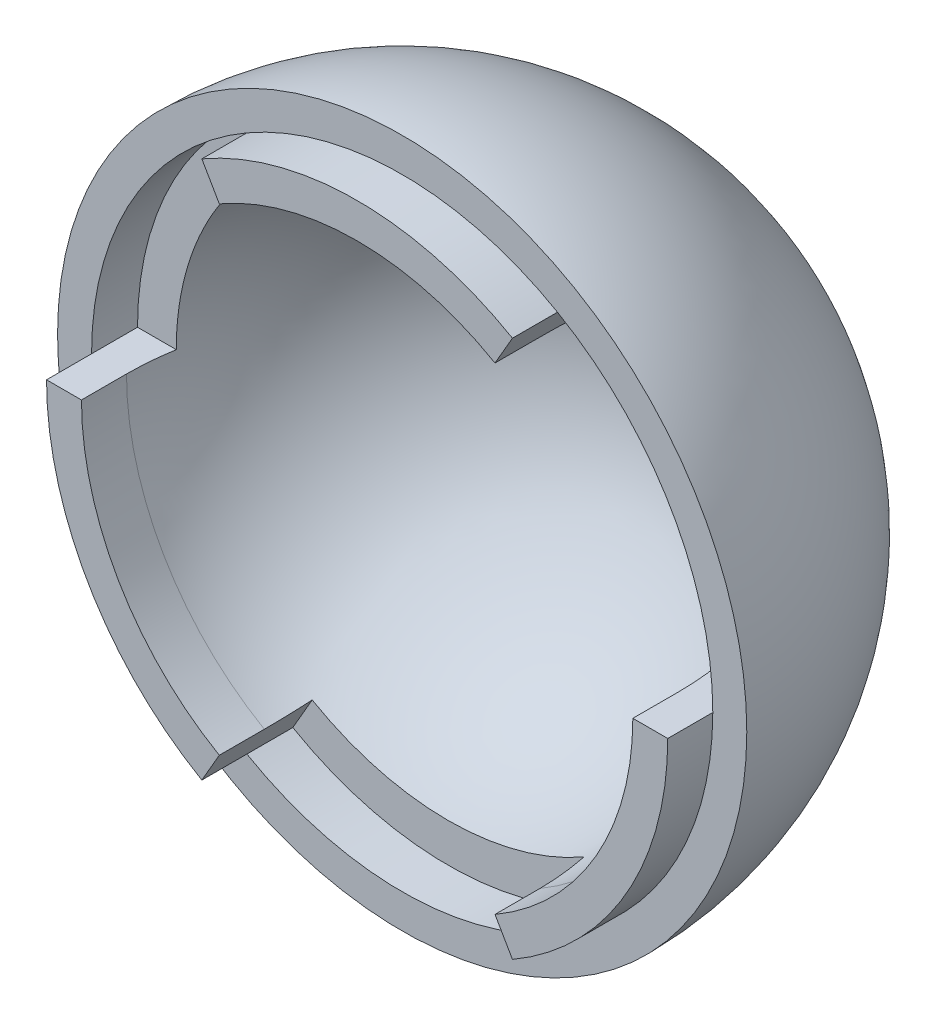
ISO-10303-21;
HEADER;
FILE_DESCRIPTION(('STEP AP214'),'2;1');
FILE_NAME('part.step','',(''),(''),'','','');
FILE_SCHEMA(('AUTOMOTIVE_DESIGN { 1 0 10303 214 1 1 1 1 }'));
ENDSEC;
DATA;
#1=APPLICATION_CONTEXT('core data for automotive mechanical design processes');
#2=APPLICATION_PROTOCOL_DEFINITION('international standard','automotive_design',2000,#1);
#3=PRODUCT_CONTEXT('',#1,'mechanical');
#4=PRODUCT('Part','Part','',(#3));
#5=PRODUCT_RELATED_PRODUCT_CATEGORY('part','',(#4));
#6=PRODUCT_DEFINITION_FORMATION('','',#4);
#7=PRODUCT_DEFINITION_CONTEXT('part definition',#1,'design');
#8=PRODUCT_DEFINITION('design','',#6,#7);
#9=PRODUCT_DEFINITION_SHAPE('','',#8);
#10=(LENGTH_UNIT() NAMED_UNIT(*) SI_UNIT(.MILLI.,.METRE.));
#11=(NAMED_UNIT(*) PLANE_ANGLE_UNIT() SI_UNIT($,.RADIAN.));
#12=(NAMED_UNIT(*) SI_UNIT($,.STERADIAN.) SOLID_ANGLE_UNIT());
#13=UNCERTAINTY_MEASURE_WITH_UNIT(LENGTH_MEASURE(1.E-05),#10,'distance_accuracy_value','');
#14=(GEOMETRIC_REPRESENTATION_CONTEXT(3) GLOBAL_UNCERTAINTY_ASSIGNED_CONTEXT((#13)) GLOBAL_UNIT_ASSIGNED_CONTEXT((#10,
#11,#12)) REPRESENTATION_CONTEXT('',''));
#15=CARTESIAN_POINT('',(0.,0.,0.));
#16=DIRECTION('',(0.,0.,1.));
#17=DIRECTION('',(1.,0.,0.));
#18=AXIS2_PLACEMENT_3D('',#15,#16,#17);
#19=CARTESIAN_POINT('',(0.,0.,0.));
#20=DIRECTION('',(0.,0.,-1.));
#21=DIRECTION('',(1.,0.,0.));
#22=AXIS2_PLACEMENT_3D('',#19,#20,#21);
#23=PLANE('',#22);
#24=CARTESIAN_POINT('',(0.,0.,0.));
#25=DIRECTION('',(0.,0.,-1.));
#26=DIRECTION('',(1.,0.,0.));
#27=AXIS2_PLACEMENT_3D('',#24,#25,#26);
#28=CIRCLE('',#27,75.);
#29=CARTESIAN_POINT('',(75.,0.,0.));
#30=VERTEX_POINT('',#29);
#31=EDGE_CURVE('E293',#30,#30,#28,.T.);
#32=ORIENTED_EDGE('',*,*,#31,.F.);
#33=EDGE_LOOP('',(#32));
#34=FACE_BOUND('',#33,.T.);
#35=CARTESIAN_POINT('',(0.,0.,0.));
#36=DIRECTION('',(0.,0.,1.));
#37=DIRECTION('',(-0.499999999999992,-0.866025403784443,0.));
#38=AXIS2_PLACEMENT_3D('',#35,#36,#37);
#39=CIRCLE('',#38,67.6);
#40=CARTESIAN_POINT('',(33.8,-58.543317295828,0.));
#41=VERTEX_POINT('',#40);
#42=CARTESIAN_POINT('',(67.6,9.40220123979429E-13,0.));
#43=VERTEX_POINT('',#42);
#44=EDGE_CURVE('E179',#41,#43,#39,.T.);
#45=ORIENTED_EDGE('',*,*,#44,.F.);
#46=CARTESIAN_POINT('',(0.,0.,0.));
#47=DIRECTION('',(0.,0.,1.));
#48=DIRECTION('',(-0.499999999999992,-0.866025403784443,0.));
#49=AXIS2_PLACEMENT_3D('',#46,#47,#48);
#50=CIRCLE('',#49,67.6);
#51=CARTESIAN_POINT('',(-33.7999999999995,-58.5433172958284,4.08805799704714E-13));
#52=VERTEX_POINT('',#51);
#53=EDGE_CURVE('E233',#52,#41,#50,.T.);
#54=ORIENTED_EDGE('',*,*,#53,.F.);
#55=CARTESIAN_POINT('',(0.,0.,0.));
#56=DIRECTION('',(0.,0.,1.));
#57=DIRECTION('',(-0.500000000000004,0.866025403784436,0.));
#58=AXIS2_PLACEMENT_3D('',#55,#56,#57);
#59=CIRCLE('',#58,67.6);
#60=CARTESIAN_POINT('',(-67.6000000000001,2.67147415300424E-13,0.));
#61=VERTEX_POINT('',#60);
#62=EDGE_CURVE('E48',#61,#52,#59,.T.);
#63=ORIENTED_EDGE('',*,*,#62,.F.);
#64=CARTESIAN_POINT('',(0.,0.,0.));
#65=DIRECTION('',(0.,0.,1.));
#66=DIRECTION('',(-0.500000000000004,0.866025403784436,0.));
#67=AXIS2_PLACEMENT_3D('',#64,#65,#66);
#68=CIRCLE('',#67,67.6);
#69=CARTESIAN_POINT('',(-33.8000000000003,58.5433172958279,-4.08805799704711E-13));
#70=VERTEX_POINT('',#69);
#71=EDGE_CURVE('E254',#70,#61,#68,.T.);
#72=ORIENTED_EDGE('',*,*,#71,.F.);
#73=CARTESIAN_POINT('',(0.,0.,0.));
#74=DIRECTION('',(0.,0.,1.));
#75=DIRECTION('',(1.,0.,0.));
#76=AXIS2_PLACEMENT_3D('',#73,#74,#75);
#77=CIRCLE('',#76,67.6);
#78=CARTESIAN_POINT('',(33.8000000000005,58.5433172958278,-4.0880579970471E-13));
#79=VERTEX_POINT('',#78);
#80=EDGE_CURVE('E54',#79,#70,#77,.T.);
#81=ORIENTED_EDGE('',*,*,#80,.F.);
#82=CARTESIAN_POINT('',(0.,0.,0.));
#83=DIRECTION('',(0.,0.,1.));
#84=DIRECTION('',(1.,0.,0.));
#85=AXIS2_PLACEMENT_3D('',#82,#83,#84);
#86=CIRCLE('',#85,67.6);
#87=EDGE_CURVE('E274',#43,#79,#86,.T.);
#88=ORIENTED_EDGE('',*,*,#87,.F.);
#89=EDGE_LOOP('',(#45,#54,#63,#72,#81,#88));
#90=FACE_BOUND('',#89,.T.);
#91=ADVANCED_FACE('F33',(#34,#90),#23,.F.);
#92=CARTESIAN_POINT('',(0.,0.,0.));
#93=DIRECTION('',(1.,0.,0.));
#94=DIRECTION('',(0.,1.,0.));
#95=AXIS2_PLACEMENT_3D('',#92,#93,#94);
#96=SPHERICAL_SURFACE('',#95,75.);
#97=CARTESIAN_POINT('',(0.,0.,0.));
#98=DIRECTION('',(0.,0.,-1.));
#99=DIRECTION('',(1.,0.,0.));
#100=AXIS2_PLACEMENT_3D('',#97,#98,#99);
#101=SPHERICAL_SURFACE('',#100,75.);
#102=ORIENTED_EDGE('',*,*,#31,.T.);
#103=EDGE_LOOP('',(#102));
#104=FACE_BOUND('',#103,.T.);
#105=ADVANCED_FACE('F365',(#104),#101,.T.);
#106=CARTESIAN_POINT('',(0.,0.,0.));
#107=DIRECTION('',(1.,0.,0.));
#108=DIRECTION('',(0.,-1.,0.));
#109=AXIS2_PLACEMENT_3D('',#106,#107,#108);
#110=SPHERICAL_SURFACE('',#109,60.);
#111=CARTESIAN_POINT('',(0.,0.,0.));
#112=DIRECTION('',(-0.866025403784443,0.499999999999992,0.));
#113=DIRECTION('',(-0.499999999999992,-0.866025403784443,0.));
#114=AXIS2_PLACEMENT_3D('',#111,#112,#113);
#115=CIRCLE('',#114,60.);
#116=CARTESIAN_POINT('',(-29.5803989154975,-51.2347538297984,-9.99999999999964));
#117=VERTEX_POINT('',#116);
#118=CARTESIAN_POINT('',(-29.9999999999995,-51.9615242270666,0.));
#119=VERTEX_POINT('',#118);
#120=EDGE_CURVE('E251',#117,#119,#115,.T.);
#121=ORIENTED_EDGE('',*,*,#120,.F.);
#122=CARTESIAN_POINT('',(0.,0.,-10.));
#123=DIRECTION('',(0.,0.,1.));
#124=DIRECTION('',(0.,-1.,0.));
#125=AXIS2_PLACEMENT_3D('',#122,#123,#124);
#126=CIRCLE('',#125,59.1607978309962);
#127=CARTESIAN_POINT('',(29.5803989154982,-51.2347538297981,-9.99999999999929));
#128=VERTEX_POINT('',#127);
#129=EDGE_CURVE('E11',#117,#128,#126,.T.);
#130=ORIENTED_EDGE('',*,*,#129,.T.);
#131=CARTESIAN_POINT('',(0.,0.,0.));
#132=DIRECTION('',(0.866025403784439,0.5,0.));
#133=DIRECTION('',(-0.5,0.866025403784439,0.));
#134=AXIS2_PLACEMENT_3D('',#131,#132,#133);
#135=CIRCLE('',#134,60.);
#136=CARTESIAN_POINT('',(30.,-51.9615242270663,7.25690768706588E-13));
#137=VERTEX_POINT('',#136);
#138=EDGE_CURVE('E247',#137,#128,#135,.T.);
#139=ORIENTED_EDGE('',*,*,#138,.F.);
#140=CARTESIAN_POINT('',(0.,0.,0.));
#141=DIRECTION('',(0.,0.,1.));
#142=DIRECTION('',(1.,0.,0.));
#143=AXIS2_PLACEMENT_3D('',#140,#141,#142);
#144=CIRCLE('',#143,60.);
#145=CARTESIAN_POINT('',(60.,8.36136715420821E-13,0.));
#146=VERTEX_POINT('',#145);
#147=EDGE_CURVE('E296',#137,#146,#144,.T.);
#148=ORIENTED_EDGE('',*,*,#147,.T.);
#149=CARTESIAN_POINT('',(0.,0.,0.));
#150=DIRECTION('',(0.,-1.,0.));
#151=DIRECTION('',(0.,0.,-1.));
#152=AXIS2_PLACEMENT_3D('',#149,#150,#151);
#153=CIRCLE('',#152,60.);
#154=CARTESIAN_POINT('',(59.1607978309962,0.,-10.));
#155=VERTEX_POINT('',#154);
#156=EDGE_CURVE('E291',#155,#146,#153,.T.);
#157=ORIENTED_EDGE('',*,*,#156,.F.);
#158=CARTESIAN_POINT('',(0.,0.,-10.));
#159=DIRECTION('',(0.,0.,1.));
#160=DIRECTION('',(1.,0.,0.));
#161=AXIS2_PLACEMENT_3D('',#158,#159,#160);
#162=CIRCLE('',#161,59.1607978309962);
#163=CARTESIAN_POINT('',(29.5803989154985,51.2347538297977,-10.));
#164=VERTEX_POINT('',#163);
#165=EDGE_CURVE('E299',#155,#164,#162,.T.);
#166=ORIENTED_EDGE('',*,*,#165,.T.);
#167=CARTESIAN_POINT('',(0.,0.,0.));
#168=DIRECTION('',(-0.866025403784434,0.500000000000008,0.));
#169=DIRECTION('',(-0.500000000000008,-0.866025403784434,0.));
#170=AXIS2_PLACEMENT_3D('',#167,#168,#169);
#171=CIRCLE('',#170,60.);
#172=CARTESIAN_POINT('',(30.0000000000004,51.9615242270661,0.));
#173=VERTEX_POINT('',#172);
#174=EDGE_CURVE('E287',#173,#164,#171,.T.);
#175=ORIENTED_EDGE('',*,*,#174,.F.);
#176=CARTESIAN_POINT('',(-30.0000000000002,51.9615242270662,0.));
#177=VERTEX_POINT('',#176);
#178=EDGE_CURVE('E297',#173,#177,#144,.T.);
#179=ORIENTED_EDGE('',*,*,#178,.T.);
#180=CARTESIAN_POINT('',(0.,0.,0.));
#181=DIRECTION('',(0.866025403784436,0.500000000000004,0.));
#182=DIRECTION('',(-0.500000000000004,0.866025403784436,0.));
#183=AXIS2_PLACEMENT_3D('',#180,#181,#182);
#184=CIRCLE('',#183,60.);
#185=CARTESIAN_POINT('',(-29.5803989154984,51.2347538297978,-10.0000000000004));
#186=VERTEX_POINT('',#185);
#187=EDGE_CURVE('E271',#186,#177,#184,.T.);
#188=ORIENTED_EDGE('',*,*,#187,.F.);
#189=CARTESIAN_POINT('',(0.,0.,-10.));
#190=DIRECTION('',(0.,0.,1.));
#191=DIRECTION('',(0.,-1.,0.));
#192=AXIS2_PLACEMENT_3D('',#189,#190,#191);
#193=CIRCLE('',#192,59.1607978309962);
#194=CARTESIAN_POINT('',(-59.1607978309962,1.2539385873303E-13,-9.99999999999964));
#195=VERTEX_POINT('',#194);
#196=EDGE_CURVE('E41',#186,#195,#193,.T.);
#197=ORIENTED_EDGE('',*,*,#196,.T.);
#198=CARTESIAN_POINT('',(0.,0.,0.));
#199=DIRECTION('',(0.,-1.,0.));
#200=DIRECTION('',(0.,0.,-1.));
#201=AXIS2_PLACEMENT_3D('',#198,#199,#200);
#202=CIRCLE('',#201,60.);
#203=CARTESIAN_POINT('',(-60.,2.33818520101181E-13,3.62845384353291E-13));
#204=VERTEX_POINT('',#203);
#205=EDGE_CURVE('E267',#204,#195,#202,.T.);
#206=ORIENTED_EDGE('',*,*,#205,.F.);
#207=EDGE_CURVE('E300',#204,#119,#144,.T.);
#208=ORIENTED_EDGE('',*,*,#207,.T.);
#209=EDGE_LOOP('',(#121,#130,#139,#148,#157,#166,#175,#179,#188,#197,#206,#208));
#210=FACE_BOUND('',#209,.T.);
#211=ADVANCED_FACE('F35',(#210),#110,.F.);
#212=CARTESIAN_POINT('',(0.,0.,-10.));
#213=DIRECTION('',(0.,0.,1.));
#214=DIRECTION('',(1.,0.,0.));
#215=AXIS2_PLACEMENT_3D('',#212,#213,#214);
#216=CYLINDRICAL_SURFACE('',#215,67.6);
#217=ORIENTED_EDGE('',*,*,#87,.T.);
#218=DIRECTION('',(0.,0.,1.));
#219=VECTOR('',#218,1.);
#220=CARTESIAN_POINT('',(33.8000000000005,58.5433172958278,-10.));
#221=LINE('',#220,#219);
#222=CARTESIAN_POINT('',(33.8000000000005,58.5433172958278,-10.));
#223=VERTEX_POINT('',#222);
#224=EDGE_CURVE('E283',#223,#79,#221,.T.);
#225=ORIENTED_EDGE('',*,*,#224,.F.);
#226=CARTESIAN_POINT('',(0.,0.,-10.));
#227=DIRECTION('',(0.,0.,1.));
#228=DIRECTION('',(1.,0.,0.));
#229=AXIS2_PLACEMENT_3D('',#226,#227,#228);
#230=CIRCLE('',#229,67.6);
#231=CARTESIAN_POINT('',(67.6,0.,-10.));
#232=VERTEX_POINT('',#231);
#233=EDGE_CURVE('E275',#232,#223,#230,.T.);
#234=ORIENTED_EDGE('',*,*,#233,.F.);
#235=DIRECTION('',(0.,0.,1.));
#236=VECTOR('',#235,1.);
#237=CARTESIAN_POINT('',(67.6,0.,-10.));
#238=LINE('',#237,#236);
#239=EDGE_CURVE('E285',#232,#43,#238,.T.);
#240=ORIENTED_EDGE('',*,*,#239,.T.);
#241=EDGE_LOOP('',(#217,#225,#234,#240));
#242=FACE_BOUND('',#241,.T.);
#243=ADVANCED_FACE('F374',(#242),#216,.F.);
#244=CARTESIAN_POINT('',(59.,0.,-10.));
#245=DIRECTION('',(0.,-1.,0.));
#246=DIRECTION('',(0.,0.,-1.));
#247=AXIS2_PLACEMENT_3D('',#244,#245,#246);
#248=PLANE('',#247);
#249=ORIENTED_EDGE('',*,*,#156,.T.);
#250=DIRECTION('',(0.,0.,-1.));
#251=VECTOR('',#250,1.);
#252=CARTESIAN_POINT('',(60.,8.36136715420821E-13,9.8));
#253=LINE('',#252,#251);
#254=CARTESIAN_POINT('',(60.,8.36136715420821E-13,9.8));
#255=VERTEX_POINT('',#254);
#256=EDGE_CURVE('E167',#255,#146,#253,.T.);
#257=ORIENTED_EDGE('',*,*,#256,.F.);
#258=DIRECTION('',(-1.,0.,0.));
#259=VECTOR('',#258,1.);
#260=CARTESIAN_POINT('',(67.6,9.40220123979429E-13,9.8));
#261=LINE('',#260,#259);
#262=CARTESIAN_POINT('',(67.6,9.40220123979429E-13,9.8));
#263=VERTEX_POINT('',#262);
#264=EDGE_CURVE('E159',#263,#255,#261,.T.);
#265=ORIENTED_EDGE('',*,*,#264,.F.);
#266=DIRECTION('',(0.,0.,-1.));
#267=VECTOR('',#266,1.);
#268=CARTESIAN_POINT('',(67.6,9.40220123979429E-13,9.8));
#269=LINE('',#268,#267);
#270=EDGE_CURVE('E165',#263,#43,#269,.T.);
#271=ORIENTED_EDGE('',*,*,#270,.T.);
#272=ORIENTED_EDGE('',*,*,#239,.F.);
#273=DIRECTION('',(1.,0.,0.));
#274=VECTOR('',#273,1.);
#275=CARTESIAN_POINT('',(59.,0.,-10.));
#276=LINE('',#275,#274);
#277=EDGE_CURVE('E281',#155,#232,#276,.T.);
#278=ORIENTED_EDGE('',*,*,#277,.F.);
#279=EDGE_LOOP('',(#249,#257,#265,#271,#272,#278));
#280=FACE_BOUND('',#279,.T.);
#281=ADVANCED_FACE('F162',(#280),#248,.F.);
#282=CARTESIAN_POINT('',(33.8000000000005,58.5433172958278,-10.));
#283=DIRECTION('',(-0.866025403784434,0.500000000000008,0.));
#284=DIRECTION('',(-0.500000000000008,-0.866025403784434,0.));
#285=AXIS2_PLACEMENT_3D('',#282,#283,#284);
#286=PLANE('',#285);
#287=ORIENTED_EDGE('',*,*,#174,.T.);
#288=DIRECTION('',(-0.500000000000008,-0.866025403784434,0.));
#289=VECTOR('',#288,1.);
#290=CARTESIAN_POINT('',(33.8000000000005,58.5433172958278,-10.));
#291=LINE('',#290,#289);
#292=EDGE_CURVE('E278',#223,#164,#291,.T.);
#293=ORIENTED_EDGE('',*,*,#292,.F.);
#294=ORIENTED_EDGE('',*,*,#224,.T.);
#295=DIRECTION('',(0.,0.,-1.));
#296=VECTOR('',#295,1.);
#297=CARTESIAN_POINT('',(33.8000000000005,58.5433172958278,9.8));
#298=LINE('',#297,#296);
#299=CARTESIAN_POINT('',(33.8000000000005,58.5433172958278,9.8));
#300=VERTEX_POINT('',#299);
#301=EDGE_CURVE('E220',#300,#79,#298,.T.);
#302=ORIENTED_EDGE('',*,*,#301,.F.);
#303=DIRECTION('',(0.500000000000011,0.866025403784432,0.));
#304=VECTOR('',#303,1.);
#305=CARTESIAN_POINT('',(30.0000000000004,51.9615242270661,9.8));
#306=LINE('',#305,#304);
#307=CARTESIAN_POINT('',(30.0000000000004,51.9615242270661,9.8));
#308=VERTEX_POINT('',#307);
#309=EDGE_CURVE('E218',#308,#300,#306,.T.);
#310=ORIENTED_EDGE('',*,*,#309,.F.);
#311=DIRECTION('',(0.,0.,-1.));
#312=VECTOR('',#311,1.);
#313=CARTESIAN_POINT('',(30.0000000000004,51.9615242270661,9.8));
#314=LINE('',#313,#312);
#315=EDGE_CURVE('E224',#308,#173,#314,.T.);
#316=ORIENTED_EDGE('',*,*,#315,.T.);
#317=EDGE_LOOP('',(#287,#293,#294,#302,#310,#316));
#318=FACE_BOUND('',#317,.T.);
#319=ADVANCED_FACE('F346',(#318),#286,.F.);
#320=CARTESIAN_POINT('',(0.,0.,-10.));
#321=DIRECTION('',(0.,0.,1.));
#322=DIRECTION('',(1.,0.,0.));
#323=AXIS2_PLACEMENT_3D('',#320,#321,#322);
#324=PLANE('',#323);
#325=ORIENTED_EDGE('',*,*,#277,.T.);
#326=ORIENTED_EDGE('',*,*,#233,.T.);
#327=ORIENTED_EDGE('',*,*,#292,.T.);
#328=ORIENTED_EDGE('',*,*,#165,.F.);
#329=EDGE_LOOP('',(#325,#326,#327,#328));
#330=FACE_BOUND('',#329,.T.);
#331=ADVANCED_FACE('F337',(#330),#324,.T.);
#332=CARTESIAN_POINT('',(0.,-1.04744440165294E-13,-10.));
#333=DIRECTION('',(0.,0.,1.));
#334=DIRECTION('',(0.,-1.,0.));
#335=AXIS2_PLACEMENT_3D('',#332,#333,#334);
#336=CYLINDRICAL_SURFACE('',#335,67.6);
#337=ORIENTED_EDGE('',*,*,#71,.T.);
#338=DIRECTION('',(0.,0.,1.));
#339=VECTOR('',#338,1.);
#340=CARTESIAN_POINT('',(-67.6000000000001,1.62402975135134E-13,-9.99999999999959));
#341=LINE('',#340,#339);
#342=CARTESIAN_POINT('',(-67.6000000000001,1.62402975135134E-13,-9.99999999999959));
#343=VERTEX_POINT('',#342);
#344=EDGE_CURVE('E263',#343,#61,#341,.T.);
#345=ORIENTED_EDGE('',*,*,#344,.F.);
#346=CARTESIAN_POINT('',(0.,-1.04744440165294E-13,-10.));
#347=DIRECTION('',(0.,0.,1.));
#348=DIRECTION('',(-0.500000000000004,0.866025403784436,0.));
#349=AXIS2_PLACEMENT_3D('',#346,#347,#348);
#350=CIRCLE('',#349,67.6);
#351=CARTESIAN_POINT('',(-33.8000000000003,58.5433172958278,-10.0000000000004));
#352=VERTEX_POINT('',#351);
#353=EDGE_CURVE('E255',#352,#343,#350,.T.);
#354=ORIENTED_EDGE('',*,*,#353,.F.);
#355=DIRECTION('',(0.,0.,1.));
#356=VECTOR('',#355,1.);
#357=CARTESIAN_POINT('',(-33.8000000000003,58.5433172958278,-10.0000000000004));
#358=LINE('',#357,#356);
#359=EDGE_CURVE('E265',#352,#70,#358,.T.);
#360=ORIENTED_EDGE('',*,*,#359,.T.);
#361=EDGE_LOOP('',(#337,#345,#354,#360));
#362=FACE_BOUND('',#361,.T.);
#363=ADVANCED_FACE('F318',(#362),#336,.F.);
#364=CARTESIAN_POINT('',(-29.5000000000003,51.0954988232816,-10.0000000000004));
#365=DIRECTION('',(0.866025403784436,0.500000000000004,0.));
#366=DIRECTION('',(-0.500000000000004,0.866025403784436,0.));
#367=AXIS2_PLACEMENT_3D('',#364,#365,#366);
#368=PLANE('',#367);
#369=ORIENTED_EDGE('',*,*,#187,.T.);
#370=DIRECTION('',(0.,0.,-1.));
#371=VECTOR('',#370,1.);
#372=CARTESIAN_POINT('',(-30.0000000000002,51.9615242270662,9.8));
#373=LINE('',#372,#371);
#374=CARTESIAN_POINT('',(-30.0000000000002,51.9615242270662,9.8));
#375=VERTEX_POINT('',#374);
#376=EDGE_CURVE('E227',#375,#177,#373,.T.);
#377=ORIENTED_EDGE('',*,*,#376,.F.);
#378=DIRECTION('',(0.500000000000004,-0.866025403784436,0.));
#379=VECTOR('',#378,1.);
#380=CARTESIAN_POINT('',(-33.8000000000003,58.5433172958279,9.8));
#381=LINE('',#380,#379);
#382=CARTESIAN_POINT('',(-33.8000000000003,58.5433172958279,9.8));
#383=VERTEX_POINT('',#382);
#384=EDGE_CURVE('E214',#383,#375,#381,.T.);
#385=ORIENTED_EDGE('',*,*,#384,.F.);
#386=DIRECTION('',(0.,0.,-1.));
#387=VECTOR('',#386,1.);
#388=CARTESIAN_POINT('',(-33.8000000000003,58.5433172958279,9.8));
#389=LINE('',#388,#387);
#390=EDGE_CURVE('E230',#383,#70,#389,.T.);
#391=ORIENTED_EDGE('',*,*,#390,.T.);
#392=ORIENTED_EDGE('',*,*,#359,.F.);
#393=DIRECTION('',(-0.500000000000004,0.866025403784436,0.));
#394=VECTOR('',#393,1.);
#395=CARTESIAN_POINT('',(-29.5000000000003,51.0954988232816,-10.0000000000004));
#396=LINE('',#395,#394);
#397=EDGE_CURVE('E261',#186,#352,#396,.T.);
#398=ORIENTED_EDGE('',*,*,#397,.F.);
#399=EDGE_LOOP('',(#369,#377,#385,#391,#392,#398));
#400=FACE_BOUND('',#399,.T.);
#401=ADVANCED_FACE('F313',(#400),#368,.F.);
#402=CARTESIAN_POINT('',(-67.6000000000001,1.62402975135134E-13,-9.99999999999959));
#403=DIRECTION('',(0.,-1.,0.));
#404=DIRECTION('',(0.,0.,-1.));
#405=AXIS2_PLACEMENT_3D('',#402,#403,#404);
#406=PLANE('',#405);
#407=ORIENTED_EDGE('',*,*,#205,.T.);
#408=DIRECTION('',(1.,0.,0.));
#409=VECTOR('',#408,1.);
#410=CARTESIAN_POINT('',(-67.6000000000001,1.62402975135134E-13,-9.99999999999959));
#411=LINE('',#410,#409);
#412=EDGE_CURVE('E258',#343,#195,#411,.T.);
#413=ORIENTED_EDGE('',*,*,#412,.F.);
#414=ORIENTED_EDGE('',*,*,#344,.T.);
#415=DIRECTION('',(0.,0.,-1.));
#416=VECTOR('',#415,1.);
#417=CARTESIAN_POINT('',(-67.6,2.70616862252382E-13,9.8));
#418=LINE('',#417,#416);
#419=CARTESIAN_POINT('',(-67.6,2.70616862252382E-13,9.8));
#420=VERTEX_POINT('',#419);
#421=EDGE_CURVE('E198',#420,#61,#418,.T.);
#422=ORIENTED_EDGE('',*,*,#421,.F.);
#423=DIRECTION('',(-1.,0.,0.));
#424=VECTOR('',#423,1.);
#425=CARTESIAN_POINT('',(-60.,2.08166817117217E-13,9.8));
#426=LINE('',#425,#424);
#427=CARTESIAN_POINT('',(-60.,2.04697370165263E-13,9.8));
#428=VERTEX_POINT('',#427);
#429=EDGE_CURVE('E197',#428,#420,#426,.T.);
#430=ORIENTED_EDGE('',*,*,#429,.F.);
#431=DIRECTION('',(0.,0.,-1.));
#432=VECTOR('',#431,1.);
#433=CARTESIAN_POINT('',(-60.,2.04697370165263E-13,9.8));
#434=LINE('',#433,#432);
#435=EDGE_CURVE('E202',#428,#204,#434,.T.);
#436=ORIENTED_EDGE('',*,*,#435,.T.);
#437=EDGE_LOOP('',(#407,#413,#414,#422,#430,#436));
#438=FACE_BOUND('',#437,.T.);
#439=ADVANCED_FACE('F321',(#438),#406,.F.);
#440=CARTESIAN_POINT('',(0.,-1.04744440165294E-13,-10.));
#441=DIRECTION('',(0.,0.,1.));
#442=DIRECTION('',(-0.500000000000004,0.866025403784436,0.));
#443=AXIS2_PLACEMENT_3D('',#440,#441,#442);
#444=PLANE('',#443);
#445=ORIENTED_EDGE('',*,*,#397,.T.);
#446=ORIENTED_EDGE('',*,*,#353,.T.);
#447=ORIENTED_EDGE('',*,*,#412,.T.);
#448=ORIENTED_EDGE('',*,*,#196,.F.);
#449=EDGE_LOOP('',(#445,#446,#447,#448));
#450=FACE_BOUND('',#449,.T.);
#451=ADVANCED_FACE('F309',(#450),#444,.T.);
#452=CARTESIAN_POINT('',(0.,-1.04744440165293E-13,-10.));
#453=DIRECTION('',(0.,0.,1.));
#454=DIRECTION('',(0.,-1.,0.));
#455=AXIS2_PLACEMENT_3D('',#452,#453,#454);
#456=CYLINDRICAL_SURFACE('',#455,67.6);
#457=ORIENTED_EDGE('',*,*,#53,.T.);
#458=DIRECTION('',(0.,0.,1.));
#459=VECTOR('',#458,1.);
#460=CARTESIAN_POINT('',(33.8000000000001,-58.5433172958281,-9.99999999999918));
#461=LINE('',#460,#459);
#462=CARTESIAN_POINT('',(33.8000000000001,-58.5433172958281,-9.99999999999918));
#463=VERTEX_POINT('',#462);
#464=EDGE_CURVE('E242',#463,#41,#461,.T.);
#465=ORIENTED_EDGE('',*,*,#464,.F.);
#466=CARTESIAN_POINT('',(0.,-1.04744440165293E-13,-10.));
#467=DIRECTION('',(0.,0.,1.));
#468=DIRECTION('',(-0.499999999999992,-0.866025403784443,0.));
#469=AXIS2_PLACEMENT_3D('',#466,#467,#468);
#470=CIRCLE('',#469,67.6);
#471=CARTESIAN_POINT('',(-33.7999999999994,-58.5433172958285,-9.99999999999959));
#472=VERTEX_POINT('',#471);
#473=EDGE_CURVE('E234',#472,#463,#470,.T.);
#474=ORIENTED_EDGE('',*,*,#473,.F.);
#475=DIRECTION('',(0.,0.,1.));
#476=VECTOR('',#475,1.);
#477=CARTESIAN_POINT('',(-33.7999999999994,-58.5433172958285,-9.99999999999959));
#478=LINE('',#477,#476);
#479=EDGE_CURVE('E245',#472,#52,#478,.T.);
#480=ORIENTED_EDGE('',*,*,#479,.T.);
#481=EDGE_LOOP('',(#457,#465,#474,#480));
#482=FACE_BOUND('',#481,.T.);
#483=ADVANCED_FACE('F392',(#482),#456,.F.);
#484=CARTESIAN_POINT('',(-29.4999999999995,-51.0954988232822,-9.99999999999964));
#485=DIRECTION('',(-0.866025403784443,0.499999999999992,0.));
#486=DIRECTION('',(-0.499999999999992,-0.866025403784443,0.));
#487=AXIS2_PLACEMENT_3D('',#484,#485,#486);
#488=PLANE('',#487);
#489=ORIENTED_EDGE('',*,*,#120,.T.);
#490=DIRECTION('',(0.,0.,-1.));
#491=VECTOR('',#490,1.);
#492=CARTESIAN_POINT('',(-29.9999999999995,-51.9615242270666,9.8));
#493=LINE('',#492,#491);
#494=CARTESIAN_POINT('',(-29.9999999999995,-51.9615242270666,9.8));
#495=VERTEX_POINT('',#494);
#496=EDGE_CURVE('E205',#495,#119,#493,.T.);
#497=ORIENTED_EDGE('',*,*,#496,.F.);
#498=DIRECTION('',(0.499999999999992,0.866025403784443,0.));
#499=VECTOR('',#498,1.);
#500=CARTESIAN_POINT('',(-33.7999999999995,-58.5433172958284,9.8));
#501=LINE('',#500,#499);
#502=CARTESIAN_POINT('',(-33.7999999999995,-58.5433172958284,9.8));
#503=VERTEX_POINT('',#502);
#504=EDGE_CURVE('E193',#503,#495,#501,.T.);
#505=ORIENTED_EDGE('',*,*,#504,.F.);
#506=DIRECTION('',(0.,0.,-1.));
#507=VECTOR('',#506,1.);
#508=CARTESIAN_POINT('',(-33.7999999999995,-58.5433172958284,9.8));
#509=LINE('',#508,#507);
#510=EDGE_CURVE('E208',#503,#52,#509,.T.);
#511=ORIENTED_EDGE('',*,*,#510,.T.);
#512=ORIENTED_EDGE('',*,*,#479,.F.);
#513=DIRECTION('',(-0.499999999999992,-0.866025403784443,0.));
#514=VECTOR('',#513,1.);
#515=CARTESIAN_POINT('',(-29.4999999999995,-51.0954988232822,-9.99999999999964));
#516=LINE('',#515,#514);
#517=EDGE_CURVE('E240',#117,#472,#516,.T.);
#518=ORIENTED_EDGE('',*,*,#517,.F.);
#519=EDGE_LOOP('',(#489,#497,#505,#511,#512,#518));
#520=FACE_BOUND('',#519,.T.);
#521=ADVANCED_FACE('F395',(#520),#488,.F.);
#522=CARTESIAN_POINT('',(33.8000000000001,-58.5433172958281,-9.99999999999918));
#523=DIRECTION('',(0.866025403784439,0.5,0.));
#524=DIRECTION('',(-0.5,0.866025403784439,0.));
#525=AXIS2_PLACEMENT_3D('',#522,#523,#524);
#526=PLANE('',#525);
#527=ORIENTED_EDGE('',*,*,#138,.T.);
#528=DIRECTION('',(-0.5,0.866025403784438,0.));
#529=VECTOR('',#528,1.);
#530=CARTESIAN_POINT('',(33.8000000000001,-58.5433172958281,-9.99999999999918));
#531=LINE('',#530,#529);
#532=EDGE_CURVE('E237',#463,#128,#531,.T.);
#533=ORIENTED_EDGE('',*,*,#532,.F.);
#534=ORIENTED_EDGE('',*,*,#464,.T.);
#535=DIRECTION('',(0.,0.,-1.));
#536=VECTOR('',#535,1.);
#537=CARTESIAN_POINT('',(33.8,-58.543317295828,9.8));
#538=LINE('',#537,#536);
#539=CARTESIAN_POINT('',(33.8,-58.543317295828,9.8));
#540=VERTEX_POINT('',#539);
#541=EDGE_CURVE('E408',#540,#41,#538,.T.);
#542=ORIENTED_EDGE('',*,*,#541,.F.);
#543=DIRECTION('',(0.499999999999997,-0.86602540378444,0.));
#544=VECTOR('',#543,1.);
#545=CARTESIAN_POINT('',(30.0000000000001,-51.9615242270663,9.8));
#546=LINE('',#545,#544);
#547=CARTESIAN_POINT('',(30.0000000000001,-51.9615242270663,9.8));
#548=VERTEX_POINT('',#547);
#549=EDGE_CURVE('E176',#548,#540,#546,.T.);
#550=ORIENTED_EDGE('',*,*,#549,.F.);
#551=DIRECTION('',(0.,0.,-1.));
#552=VECTOR('',#551,1.);
#553=CARTESIAN_POINT('',(30.0000000000001,-51.9615242270663,9.8));
#554=LINE('',#553,#552);
#555=EDGE_CURVE('E187',#548,#137,#554,.T.);
#556=ORIENTED_EDGE('',*,*,#555,.T.);
#557=EDGE_LOOP('',(#527,#533,#534,#542,#550,#556));
#558=FACE_BOUND('',#557,.T.);
#559=ADVANCED_FACE('F361',(#558),#526,.F.);
#560=CARTESIAN_POINT('',(0.,-1.04744440165293E-13,-10.));
#561=DIRECTION('',(0.,0.,1.));
#562=DIRECTION('',(-0.499999999999992,-0.866025403784443,0.));
#563=AXIS2_PLACEMENT_3D('',#560,#561,#562);
#564=PLANE('',#563);
#565=ORIENTED_EDGE('',*,*,#517,.T.);
#566=ORIENTED_EDGE('',*,*,#473,.T.);
#567=ORIENTED_EDGE('',*,*,#532,.T.);
#568=ORIENTED_EDGE('',*,*,#129,.F.);
#569=EDGE_LOOP('',(#565,#566,#567,#568));
#570=FACE_BOUND('',#569,.T.);
#571=ADVANCED_FACE('F354',(#570),#564,.T.);
#572=CARTESIAN_POINT('',(0.,0.,9.8));
#573=DIRECTION('',(0.,0.,-1.));
#574=DIRECTION('',(-1.,0.,0.));
#575=AXIS2_PLACEMENT_3D('',#572,#573,#574);
#576=CYLINDRICAL_SURFACE('',#575,67.6);
#577=ORIENTED_EDGE('',*,*,#80,.T.);
#578=ORIENTED_EDGE('',*,*,#390,.F.);
#579=CARTESIAN_POINT('',(0.,0.,9.8));
#580=DIRECTION('',(0.,0.,1.));
#581=DIRECTION('',(1.,0.,0.));
#582=AXIS2_PLACEMENT_3D('',#579,#580,#581);
#583=CIRCLE('',#582,67.6);
#584=EDGE_CURVE('E211',#300,#383,#583,.T.);
#585=ORIENTED_EDGE('',*,*,#584,.F.);
#586=ORIENTED_EDGE('',*,*,#301,.T.);
#587=EDGE_LOOP('',(#577,#578,#585,#586));
#588=FACE_BOUND('',#587,.T.);
#589=ADVANCED_FACE('F352',(#588),#576,.T.);
#590=CARTESIAN_POINT('',(0.,0.,9.8));
#591=DIRECTION('',(0.,0.,-1.));
#592=DIRECTION('',(-1.,0.,0.));
#593=AXIS2_PLACEMENT_3D('',#590,#591,#592);
#594=CYLINDRICAL_SURFACE('',#593,60.);
#595=ORIENTED_EDGE('',*,*,#178,.F.);
#596=ORIENTED_EDGE('',*,*,#315,.F.);
#597=CARTESIAN_POINT('',(0.,0.,9.8));
#598=DIRECTION('',(0.,0.,-1.));
#599=DIRECTION('',(1.,0.,0.));
#600=AXIS2_PLACEMENT_3D('',#597,#598,#599);
#601=CIRCLE('',#600,60.);
#602=EDGE_CURVE('E216',#375,#308,#601,.T.);
#603=ORIENTED_EDGE('',*,*,#602,.F.);
#604=ORIENTED_EDGE('',*,*,#376,.T.);
#605=EDGE_LOOP('',(#595,#596,#603,#604));
#606=FACE_BOUND('',#605,.T.);
#607=ADVANCED_FACE('F343',(#606),#594,.F.);
#608=CARTESIAN_POINT('',(0.,0.,9.8));
#609=DIRECTION('',(0.,0.,1.));
#610=DIRECTION('',(1.,0.,0.));
#611=AXIS2_PLACEMENT_3D('',#608,#609,#610);
#612=PLANE('',#611);
#613=ORIENTED_EDGE('',*,*,#584,.T.);
#614=ORIENTED_EDGE('',*,*,#384,.T.);
#615=ORIENTED_EDGE('',*,*,#602,.T.);
#616=ORIENTED_EDGE('',*,*,#309,.T.);
#617=EDGE_LOOP('',(#613,#614,#615,#616));
#618=FACE_BOUND('',#617,.T.);
#619=ADVANCED_FACE('F350',(#618),#612,.T.);
#620=CARTESIAN_POINT('',(0.,0.,9.8));
#621=DIRECTION('',(0.,0.,-1.));
#622=DIRECTION('',(-1.,0.,0.));
#623=AXIS2_PLACEMENT_3D('',#620,#621,#622);
#624=CYLINDRICAL_SURFACE('',#623,67.6);
#625=ORIENTED_EDGE('',*,*,#62,.T.);
#626=ORIENTED_EDGE('',*,*,#510,.F.);
#627=CARTESIAN_POINT('',(0.,0.,9.8));
#628=DIRECTION('',(0.,0.,1.));
#629=DIRECTION('',(-0.500000000000004,0.866025403784436,0.));
#630=AXIS2_PLACEMENT_3D('',#627,#628,#629);
#631=CIRCLE('',#630,67.6);
#632=EDGE_CURVE('E185',#420,#503,#631,.T.);
#633=ORIENTED_EDGE('',*,*,#632,.F.);
#634=ORIENTED_EDGE('',*,*,#421,.T.);
#635=EDGE_LOOP('',(#625,#626,#633,#634));
#636=FACE_BOUND('',#635,.T.);
#637=ADVANCED_FACE('F429',(#636),#624,.T.);
#638=CARTESIAN_POINT('',(0.,0.,9.8));
#639=DIRECTION('',(0.,0.,-1.));
#640=DIRECTION('',(-1.,0.,0.));
#641=AXIS2_PLACEMENT_3D('',#638,#639,#640);
#642=CYLINDRICAL_SURFACE('',#641,60.);
#643=ORIENTED_EDGE('',*,*,#207,.F.);
#644=ORIENTED_EDGE('',*,*,#435,.F.);
#645=CARTESIAN_POINT('',(0.,0.,9.8));
#646=DIRECTION('',(0.,0.,-1.));
#647=DIRECTION('',(-0.500000000000004,0.866025403784436,0.));
#648=AXIS2_PLACEMENT_3D('',#645,#646,#647);
#649=CIRCLE('',#648,60.);
#650=EDGE_CURVE('E195',#495,#428,#649,.T.);
#651=ORIENTED_EDGE('',*,*,#650,.F.);
#652=ORIENTED_EDGE('',*,*,#496,.T.);
#653=EDGE_LOOP('',(#643,#644,#651,#652));
#654=FACE_BOUND('',#653,.T.);
#655=ADVANCED_FACE('F326',(#654),#642,.F.);
#656=CARTESIAN_POINT('',(0.,0.,9.8));
#657=DIRECTION('',(0.,0.,1.));
#658=DIRECTION('',(-0.500000000000004,0.866025403784436,0.));
#659=AXIS2_PLACEMENT_3D('',#656,#657,#658);
#660=PLANE('',#659);
#661=ORIENTED_EDGE('',*,*,#632,.T.);
#662=ORIENTED_EDGE('',*,*,#504,.T.);
#663=ORIENTED_EDGE('',*,*,#650,.T.);
#664=ORIENTED_EDGE('',*,*,#429,.T.);
#665=EDGE_LOOP('',(#661,#662,#663,#664));
#666=FACE_BOUND('',#665,.T.);
#667=ADVANCED_FACE('F421',(#666),#660,.T.);
#668=CARTESIAN_POINT('',(0.,0.,9.8));
#669=DIRECTION('',(0.,0.,-1.));
#670=DIRECTION('',(-1.,0.,0.));
#671=AXIS2_PLACEMENT_3D('',#668,#669,#670);
#672=CYLINDRICAL_SURFACE('',#671,67.6);
#673=ORIENTED_EDGE('',*,*,#44,.T.);
#674=ORIENTED_EDGE('',*,*,#270,.F.);
#675=CARTESIAN_POINT('',(0.,0.,9.8));
#676=DIRECTION('',(0.,0.,1.));
#677=DIRECTION('',(-0.499999999999992,-0.866025403784443,0.));
#678=AXIS2_PLACEMENT_3D('',#675,#676,#677);
#679=CIRCLE('',#678,67.6);
#680=EDGE_CURVE('E171',#540,#263,#679,.T.);
#681=ORIENTED_EDGE('',*,*,#680,.F.);
#682=ORIENTED_EDGE('',*,*,#541,.T.);
#683=EDGE_LOOP('',(#673,#674,#681,#682));
#684=FACE_BOUND('',#683,.T.);
#685=ADVANCED_FACE('F181',(#684),#672,.T.);
#686=CARTESIAN_POINT('',(0.,0.,9.8));
#687=DIRECTION('',(0.,0.,-1.));
#688=DIRECTION('',(-1.,0.,0.));
#689=AXIS2_PLACEMENT_3D('',#686,#687,#688);
#690=CYLINDRICAL_SURFACE('',#689,60.);
#691=ORIENTED_EDGE('',*,*,#147,.F.);
#692=ORIENTED_EDGE('',*,*,#555,.F.);
#693=CARTESIAN_POINT('',(0.,0.,9.8));
#694=DIRECTION('',(0.,0.,-1.));
#695=DIRECTION('',(-0.499999999999992,-0.866025403784443,0.));
#696=AXIS2_PLACEMENT_3D('',#693,#694,#695);
#697=CIRCLE('',#696,60.);
#698=EDGE_CURVE('E170',#255,#548,#697,.T.);
#699=ORIENTED_EDGE('',*,*,#698,.F.);
#700=ORIENTED_EDGE('',*,*,#256,.T.);
#701=EDGE_LOOP('',(#691,#692,#699,#700));
#702=FACE_BOUND('',#701,.T.);
#703=ADVANCED_FACE('F413',(#702),#690,.F.);
#704=CARTESIAN_POINT('',(0.,0.,9.8));
#705=DIRECTION('',(0.,0.,1.));
#706=DIRECTION('',(-0.499999999999992,-0.866025403784443,0.));
#707=AXIS2_PLACEMENT_3D('',#704,#705,#706);
#708=PLANE('',#707);
#709=ORIENTED_EDGE('',*,*,#680,.T.);
#710=ORIENTED_EDGE('',*,*,#264,.T.);
#711=ORIENTED_EDGE('',*,*,#698,.T.);
#712=ORIENTED_EDGE('',*,*,#549,.T.);
#713=EDGE_LOOP('',(#709,#710,#711,#712));
#714=FACE_BOUND('',#713,.T.);
#715=ADVANCED_FACE('F174',(#714),#708,.T.);
#716=CLOSED_SHELL('',(#91,#105,#211,#243,#281,#319,#331,#363,#401,#439,#451,#483,#521,#559,#571,
#589,#607,#619,#637,#655,#667,#685,#703,#715));
#717=MANIFOLD_SOLID_BREP('B2',#716);
#718=ADVANCED_BREP_SHAPE_REPRESENTATION('',(#18,#717),#14);
#719=SHAPE_DEFINITION_REPRESENTATION(#9,#718);
ENDSEC;
END-ISO-10303-21;
